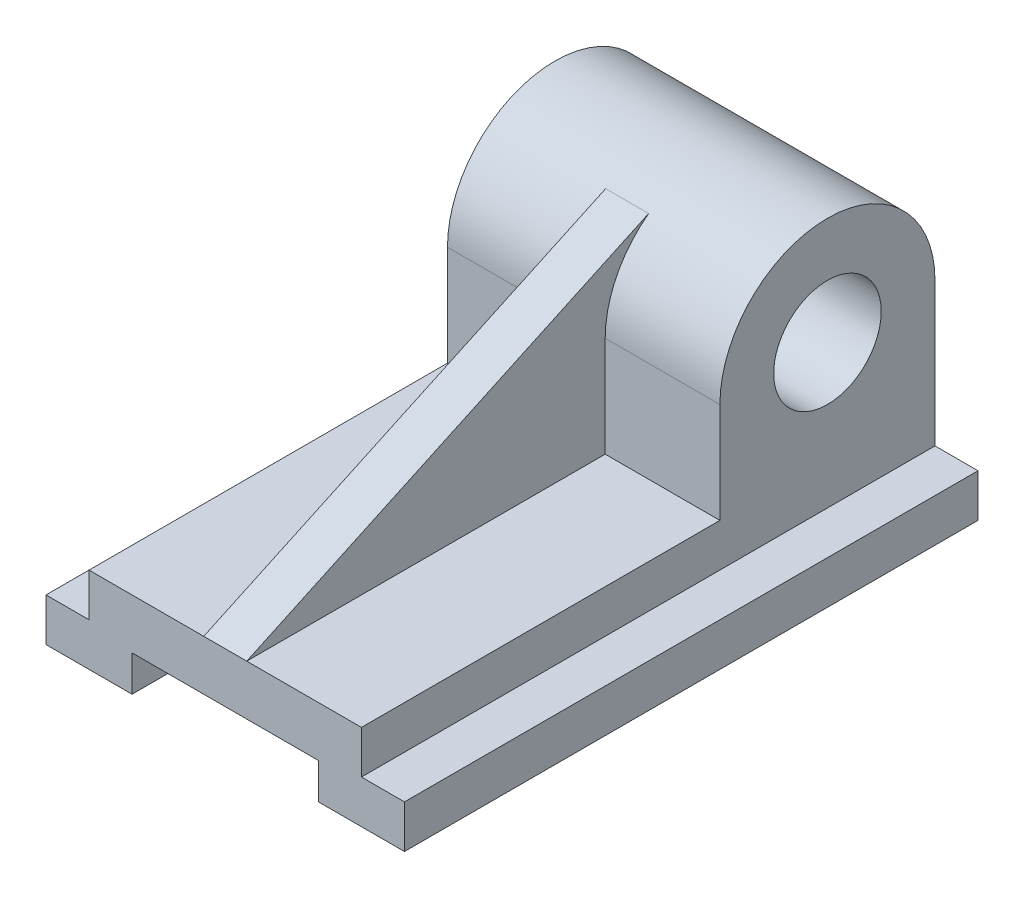
ISO-10303-21;
HEADER;
FILE_DESCRIPTION(('STEP AP214'),'2;1');
FILE_NAME('part.step','',(''),(''),'','','');
FILE_SCHEMA(('AUTOMOTIVE_DESIGN { 1 0 10303 214 1 1 1 1 }'));
ENDSEC;
DATA;
#1=APPLICATION_CONTEXT('core data for automotive mechanical design processes');
#2=APPLICATION_PROTOCOL_DEFINITION('international standard','automotive_design',2000,#1);
#3=PRODUCT_CONTEXT('',#1,'mechanical');
#4=PRODUCT('Part','Part','',(#3));
#5=PRODUCT_RELATED_PRODUCT_CATEGORY('part','',(#4));
#6=PRODUCT_DEFINITION_FORMATION('','',#4);
#7=PRODUCT_DEFINITION_CONTEXT('part definition',#1,'design');
#8=PRODUCT_DEFINITION('design','',#6,#7);
#9=PRODUCT_DEFINITION_SHAPE('','',#8);
#10=(LENGTH_UNIT() NAMED_UNIT(*) SI_UNIT(.MILLI.,.METRE.));
#11=(NAMED_UNIT(*) PLANE_ANGLE_UNIT() SI_UNIT($,.RADIAN.));
#12=(NAMED_UNIT(*) SI_UNIT($,.STERADIAN.) SOLID_ANGLE_UNIT());
#13=UNCERTAINTY_MEASURE_WITH_UNIT(LENGTH_MEASURE(1.E-05),#10,'distance_accuracy_value','');
#14=(GEOMETRIC_REPRESENTATION_CONTEXT(3) GLOBAL_UNCERTAINTY_ASSIGNED_CONTEXT((#13)) GLOBAL_UNIT_ASSIGNED_CONTEXT((#10,
#11,#12)) REPRESENTATION_CONTEXT('',''));
#15=CARTESIAN_POINT('',(0.,0.,0.));
#16=DIRECTION('',(0.,0.,1.));
#17=DIRECTION('',(1.,0.,0.));
#18=AXIS2_PLACEMENT_3D('',#15,#16,#17);
#19=CARTESIAN_POINT('',(0.,0.,160.));
#20=DIRECTION('',(0.,-1.,0.));
#21=DIRECTION('',(1.,0.,0.));
#22=AXIS2_PLACEMENT_3D('',#19,#20,#21);
#23=PLANE('',#22);
#24=DIRECTION('',(0.,0.,1.));
#25=VECTOR('',#24,1.);
#26=CARTESIAN_POINT('',(-5.99999999999999,0.,47.881736725958));
#27=LINE('',#26,#25);
#28=CARTESIAN_POINT('',(-5.99999999999999,0.,60.));
#29=VERTEX_POINT('',#28);
#30=CARTESIAN_POINT('',(-5.99999999999998,0.,160.));
#31=VERTEX_POINT('',#30);
#32=EDGE_CURVE('E169',#29,#31,#27,.T.);
#33=ORIENTED_EDGE('',*,*,#32,.F.);
#34=DIRECTION('',(1.,0.,0.));
#35=VECTOR('',#34,1.);
#36=CARTESIAN_POINT('',(-38.,0.,60.));
#37=LINE('',#36,#35);
#38=CARTESIAN_POINT('',(-38.,0.,60.));
#39=VERTEX_POINT('',#38);
#40=EDGE_CURVE('E57',#39,#29,#37,.T.);
#41=ORIENTED_EDGE('',*,*,#40,.F.);
#42=DIRECTION('',(0.,0.,-1.));
#43=VECTOR('',#42,1.);
#44=CARTESIAN_POINT('',(-38.,0.,160.));
#45=LINE('',#44,#43);
#46=CARTESIAN_POINT('',(-38.,0.,160.));
#47=VERTEX_POINT('',#46);
#48=EDGE_CURVE('E185',#47,#39,#45,.T.);
#49=ORIENTED_EDGE('',*,*,#48,.F.);
#50=DIRECTION('',(-1.,0.,0.));
#51=VECTOR('',#50,1.);
#52=CARTESIAN_POINT('',(38.,0.,160.));
#53=LINE('',#52,#51);
#54=EDGE_CURVE('E176',#31,#47,#53,.T.);
#55=ORIENTED_EDGE('',*,*,#54,.F.);
#56=EDGE_LOOP('',(#33,#41,#49,#55));
#57=FACE_BOUND('',#56,.T.);
#58=ADVANCED_FACE('F35',(#57),#23,.F.);
#59=DIRECTION('',(0.,0.,-1.));
#60=VECTOR('',#59,1.);
#61=CARTESIAN_POINT('',(6.00000000000002,0.,160.));
#62=LINE('',#61,#60);
#63=CARTESIAN_POINT('',(6.00000000000002,0.,160.));
#64=VERTEX_POINT('',#63);
#65=CARTESIAN_POINT('',(6.00000000000001,0.,60.));
#66=VERTEX_POINT('',#65);
#67=EDGE_CURVE('E183',#64,#66,#62,.T.);
#68=ORIENTED_EDGE('',*,*,#67,.F.);
#69=CARTESIAN_POINT('',(38.,0.,160.));
#70=VERTEX_POINT('',#69);
#71=EDGE_CURVE('E178',#70,#64,#53,.T.);
#72=ORIENTED_EDGE('',*,*,#71,.F.);
#73=DIRECTION('',(0.,0.,-1.));
#74=VECTOR('',#73,1.);
#75=CARTESIAN_POINT('',(38.,0.,160.));
#76=LINE('',#75,#74);
#77=CARTESIAN_POINT('',(38.,0.,60.));
#78=VERTEX_POINT('',#77);
#79=EDGE_CURVE('E217',#70,#78,#76,.T.);
#80=ORIENTED_EDGE('',*,*,#79,.T.);
#81=EDGE_CURVE('E301',#66,#78,#37,.T.);
#82=ORIENTED_EDGE('',*,*,#81,.F.);
#83=EDGE_LOOP('',(#68,#72,#80,#82));
#84=FACE_BOUND('',#83,.T.);
#85=ADVANCED_FACE('F368',(#84),#23,.F.);
#86=CARTESIAN_POINT('',(-38.,0.,60.));
#87=DIRECTION('',(0.,0.,-1.));
#88=DIRECTION('',(0.,1.,0.));
#89=AXIS2_PLACEMENT_3D('',#86,#87,#88);
#90=PLANE('',#89);
#91=DIRECTION('',(0.,-1.,0.));
#92=VECTOR('',#91,1.);
#93=CARTESIAN_POINT('',(-5.99999999999999,0.,60.));
#94=LINE('',#93,#92);
#95=CARTESIAN_POINT('',(-5.99999999999999,28.,60.));
#96=VERTEX_POINT('',#95);
#97=EDGE_CURVE('E182',#96,#29,#94,.T.);
#98=ORIENTED_EDGE('',*,*,#97,.F.);
#99=DIRECTION('',(1.,0.,0.));
#100=VECTOR('',#99,1.);
#101=CARTESIAN_POINT('',(-38.,28.,60.));
#102=LINE('',#101,#100);
#103=CARTESIAN_POINT('',(-38.,28.,60.));
#104=VERTEX_POINT('',#103);
#105=EDGE_CURVE('E277',#104,#96,#102,.T.);
#106=ORIENTED_EDGE('',*,*,#105,.F.);
#107=DIRECTION('',(0.,1.,0.));
#108=VECTOR('',#107,1.);
#109=CARTESIAN_POINT('',(-38.,0.,60.));
#110=LINE('',#109,#108);
#111=EDGE_CURVE('E295',#39,#104,#110,.T.);
#112=ORIENTED_EDGE('',*,*,#111,.F.);
#113=ORIENTED_EDGE('',*,*,#40,.T.);
#114=EDGE_LOOP('',(#98,#106,#112,#113));
#115=FACE_BOUND('',#114,.T.);
#116=ADVANCED_FACE('F279',(#115),#90,.F.);
#117=DIRECTION('',(0.,1.,0.));
#118=VECTOR('',#117,1.);
#119=CARTESIAN_POINT('',(6.00000000000001,0.,60.));
#120=LINE('',#119,#118);
#121=CARTESIAN_POINT('',(6.00000000000001,28.,60.));
#122=VERTEX_POINT('',#121);
#123=EDGE_CURVE('E49',#66,#122,#120,.T.);
#124=ORIENTED_EDGE('',*,*,#123,.F.);
#125=ORIENTED_EDGE('',*,*,#81,.T.);
#126=DIRECTION('',(0.,1.,0.));
#127=VECTOR('',#126,1.);
#128=CARTESIAN_POINT('',(38.,0.,60.));
#129=LINE('',#128,#127);
#130=CARTESIAN_POINT('',(38.,28.,60.));
#131=VERTEX_POINT('',#130);
#132=EDGE_CURVE('E293',#78,#131,#129,.T.);
#133=ORIENTED_EDGE('',*,*,#132,.T.);
#134=EDGE_CURVE('E302',#122,#131,#102,.T.);
#135=ORIENTED_EDGE('',*,*,#134,.F.);
#136=EDGE_LOOP('',(#124,#125,#133,#135));
#137=FACE_BOUND('',#136,.T.);
#138=ADVANCED_FACE('F387',(#137),#90,.F.);
#139=CARTESIAN_POINT('',(-38.,28.,30.));
#140=DIRECTION('',(1.,0.,0.));
#141=DIRECTION('',(0.,0.,-1.));
#142=AXIS2_PLACEMENT_3D('',#139,#140,#141);
#143=CYLINDRICAL_SURFACE('',#142,30.);
#144=ORIENTED_EDGE('',*,*,#134,.T.);
#145=CARTESIAN_POINT('',(38.,28.,30.));
#146=DIRECTION('',(1.,0.,0.));
#147=DIRECTION('',(0.,0.,-1.));
#148=AXIS2_PLACEMENT_3D('',#145,#146,#147);
#149=CIRCLE('',#148,30.);
#150=CARTESIAN_POINT('',(38.,28.,0.));
#151=VERTEX_POINT('',#150);
#152=EDGE_CURVE('E284',#151,#131,#149,.T.);
#153=ORIENTED_EDGE('',*,*,#152,.F.);
#154=DIRECTION('',(1.,0.,0.));
#155=VECTOR('',#154,1.);
#156=CARTESIAN_POINT('',(-38.,28.,0.));
#157=LINE('',#156,#155);
#158=CARTESIAN_POINT('',(-38.,28.,0.));
#159=VERTEX_POINT('',#158);
#160=EDGE_CURVE('E194',#159,#151,#157,.T.);
#161=ORIENTED_EDGE('',*,*,#160,.F.);
#162=CARTESIAN_POINT('',(-38.,28.,30.));
#163=DIRECTION('',(1.,0.,0.));
#164=DIRECTION('',(0.,0.,-1.));
#165=AXIS2_PLACEMENT_3D('',#162,#163,#164);
#166=CIRCLE('',#165,30.);
#167=EDGE_CURVE('E292',#159,#104,#166,.T.);
#168=ORIENTED_EDGE('',*,*,#167,.T.);
#169=ORIENTED_EDGE('',*,*,#105,.T.);
#170=CARTESIAN_POINT('',(-5.99999999999999,28.,30.));
#171=DIRECTION('',(1.,0.,0.));
#172=DIRECTION('',(0.,0.,-1.));
#173=AXIS2_PLACEMENT_3D('',#170,#171,#172);
#174=CIRCLE('',#173,30.);
#175=CARTESIAN_POINT('',(-5.99999999999999,52.0882438476433,47.881736725958));
#176=VERTEX_POINT('',#175);
#177=EDGE_CURVE('E11',#96,#176,#174,.F.);
#178=ORIENTED_EDGE('',*,*,#177,.T.);
#179=DIRECTION('',(1.,0.,0.));
#180=VECTOR('',#179,1.);
#181=CARTESIAN_POINT('',(-38.,52.0882438476433,47.881736725958));
#182=LINE('',#181,#180);
#183=CARTESIAN_POINT('',(6.00000000000001,52.0882438476433,47.881736725958));
#184=VERTEX_POINT('',#183);
#185=EDGE_CURVE('E42',#176,#184,#182,.T.);
#186=ORIENTED_EDGE('',*,*,#185,.T.);
#187=CARTESIAN_POINT('',(6.00000000000001,28.,30.));
#188=DIRECTION('',(-1.,0.,0.));
#189=DIRECTION('',(0.,0.,1.));
#190=AXIS2_PLACEMENT_3D('',#187,#188,#189);
#191=CIRCLE('',#190,30.);
#192=EDGE_CURVE('E270',#184,#122,#191,.F.);
#193=ORIENTED_EDGE('',*,*,#192,.T.);
#194=EDGE_LOOP('',(#144,#153,#161,#168,#169,#178,#186,#193));
#195=FACE_BOUND('',#194,.T.);
#196=ADVANCED_FACE('F273',(#195),#143,.T.);
#197=CARTESIAN_POINT('',(-38.,0.,160.));
#198=DIRECTION('',(1.,0.,0.));
#199=DIRECTION('',(0.,0.,-1.));
#200=AXIS2_PLACEMENT_3D('',#197,#198,#199);
#201=PLANE('',#200);
#202=DIRECTION('',(0.,-1.,0.));
#203=VECTOR('',#202,1.);
#204=CARTESIAN_POINT('',(-38.,0.,0.));
#205=LINE('',#204,#203);
#206=CARTESIAN_POINT('',(-38.,-12.,0.));
#207=VERTEX_POINT('',#206);
#208=EDGE_CURVE('E218',#159,#207,#205,.T.);
#209=ORIENTED_EDGE('',*,*,#208,.T.);
#210=DIRECTION('',(0.,0.,-1.));
#211=VECTOR('',#210,1.);
#212=CARTESIAN_POINT('',(-38.,-12.,160.));
#213=LINE('',#212,#211);
#214=CARTESIAN_POINT('',(-38.,-12.,160.));
#215=VERTEX_POINT('',#214);
#216=EDGE_CURVE('E266',#215,#207,#213,.T.);
#217=ORIENTED_EDGE('',*,*,#216,.F.);
#218=DIRECTION('',(0.,-1.,0.));
#219=VECTOR('',#218,1.);
#220=CARTESIAN_POINT('',(-38.,0.,160.));
#221=LINE('',#220,#219);
#222=EDGE_CURVE('E189',#47,#215,#221,.T.);
#223=ORIENTED_EDGE('',*,*,#222,.F.);
#224=ORIENTED_EDGE('',*,*,#48,.T.);
#225=ORIENTED_EDGE('',*,*,#111,.T.);
#226=ORIENTED_EDGE('',*,*,#167,.F.);
#227=EDGE_LOOP('',(#209,#217,#223,#224,#225,#226));
#228=FACE_BOUND('',#227,.T.);
#229=CARTESIAN_POINT('',(-38.,28.,30.));
#230=DIRECTION('',(1.,0.,0.));
#231=DIRECTION('',(0.,0.,-1.));
#232=AXIS2_PLACEMENT_3D('',#229,#230,#231);
#233=CIRCLE('',#232,15.);
#234=CARTESIAN_POINT('',(-38.,28.,15.));
#235=VERTEX_POINT('',#234);
#236=EDGE_CURVE('E289',#235,#235,#233,.T.);
#237=ORIENTED_EDGE('',*,*,#236,.T.);
#238=EDGE_LOOP('',(#237));
#239=FACE_BOUND('',#238,.T.);
#240=ADVANCED_FACE('F363',(#228,#239),#201,.F.);
#241=CARTESIAN_POINT('',(-38.,-12.,160.));
#242=DIRECTION('',(0.,-1.,0.));
#243=DIRECTION('',(1.,0.,0.));
#244=AXIS2_PLACEMENT_3D('',#241,#242,#243);
#245=PLANE('',#244);
#246=DIRECTION('',(-1.,0.,0.));
#247=VECTOR('',#246,1.);
#248=CARTESIAN_POINT('',(-38.,-12.,0.));
#249=LINE('',#248,#247);
#250=CARTESIAN_POINT('',(-50.,-12.,0.));
#251=VERTEX_POINT('',#250);
#252=EDGE_CURVE('E220',#207,#251,#249,.T.);
#253=ORIENTED_EDGE('',*,*,#252,.T.);
#254=DIRECTION('',(0.,0.,-1.));
#255=VECTOR('',#254,1.);
#256=CARTESIAN_POINT('',(-50.,-12.,160.));
#257=LINE('',#256,#255);
#258=CARTESIAN_POINT('',(-50.,-12.,160.));
#259=VERTEX_POINT('',#258);
#260=EDGE_CURVE('E263',#259,#251,#257,.T.);
#261=ORIENTED_EDGE('',*,*,#260,.F.);
#262=DIRECTION('',(-1.,0.,0.));
#263=VECTOR('',#262,1.);
#264=CARTESIAN_POINT('',(-38.,-12.,160.));
#265=LINE('',#264,#263);
#266=EDGE_CURVE('E197',#215,#259,#265,.T.);
#267=ORIENTED_EDGE('',*,*,#266,.F.);
#268=ORIENTED_EDGE('',*,*,#216,.T.);
#269=EDGE_LOOP('',(#253,#261,#267,#268));
#270=FACE_BOUND('',#269,.T.);
#271=ADVANCED_FACE('F360',(#270),#245,.F.);
#272=CARTESIAN_POINT('',(-50.,-12.,160.));
#273=DIRECTION('',(1.,0.,0.));
#274=DIRECTION('',(0.,1.,0.));
#275=AXIS2_PLACEMENT_3D('',#272,#273,#274);
#276=PLANE('',#275);
#277=DIRECTION('',(0.,-1.,0.));
#278=VECTOR('',#277,1.);
#279=CARTESIAN_POINT('',(-50.,-12.,0.));
#280=LINE('',#279,#278);
#281=CARTESIAN_POINT('',(-50.,-24.,0.));
#282=VERTEX_POINT('',#281);
#283=EDGE_CURVE('E222',#251,#282,#280,.T.);
#284=ORIENTED_EDGE('',*,*,#283,.T.);
#285=DIRECTION('',(0.,0.,-1.));
#286=VECTOR('',#285,1.);
#287=CARTESIAN_POINT('',(-50.,-24.,160.));
#288=LINE('',#287,#286);
#289=CARTESIAN_POINT('',(-50.,-24.,160.));
#290=VERTEX_POINT('',#289);
#291=EDGE_CURVE('E260',#290,#282,#288,.T.);
#292=ORIENTED_EDGE('',*,*,#291,.F.);
#293=DIRECTION('',(0.,-1.,0.));
#294=VECTOR('',#293,1.);
#295=CARTESIAN_POINT('',(-50.,-12.,160.));
#296=LINE('',#295,#294);
#297=EDGE_CURVE('E199',#259,#290,#296,.T.);
#298=ORIENTED_EDGE('',*,*,#297,.F.);
#299=ORIENTED_EDGE('',*,*,#260,.T.);
#300=EDGE_LOOP('',(#284,#292,#298,#299));
#301=FACE_BOUND('',#300,.T.);
#302=ADVANCED_FACE('F355',(#301),#276,.F.);
#303=CARTESIAN_POINT('',(-50.,-24.,160.));
#304=DIRECTION('',(0.,1.,0.));
#305=DIRECTION('',(0.,0.,1.));
#306=AXIS2_PLACEMENT_3D('',#303,#304,#305);
#307=PLANE('',#306);
#308=DIRECTION('',(1.,0.,0.));
#309=VECTOR('',#308,1.);
#310=CARTESIAN_POINT('',(-50.,-24.,0.));
#311=LINE('',#310,#309);
#312=CARTESIAN_POINT('',(-26.,-24.,0.));
#313=VERTEX_POINT('',#312);
#314=EDGE_CURVE('E224',#282,#313,#311,.T.);
#315=ORIENTED_EDGE('',*,*,#314,.T.);
#316=DIRECTION('',(0.,0.,-1.));
#317=VECTOR('',#316,1.);
#318=CARTESIAN_POINT('',(-26.,-24.,160.));
#319=LINE('',#318,#317);
#320=CARTESIAN_POINT('',(-26.,-24.,160.));
#321=VERTEX_POINT('',#320);
#322=EDGE_CURVE('E257',#321,#313,#319,.T.);
#323=ORIENTED_EDGE('',*,*,#322,.F.);
#324=DIRECTION('',(1.,0.,0.));
#325=VECTOR('',#324,1.);
#326=CARTESIAN_POINT('',(-50.,-24.,160.));
#327=LINE('',#326,#325);
#328=EDGE_CURVE('E201',#290,#321,#327,.T.);
#329=ORIENTED_EDGE('',*,*,#328,.F.);
#330=ORIENTED_EDGE('',*,*,#291,.T.);
#331=EDGE_LOOP('',(#315,#323,#329,#330));
#332=FACE_BOUND('',#331,.T.);
#333=ADVANCED_FACE('F351',(#332),#307,.F.);
#334=CARTESIAN_POINT('',(-26.,-24.,160.));
#335=DIRECTION('',(-1.,0.,0.));
#336=DIRECTION('',(0.,-1.,0.));
#337=AXIS2_PLACEMENT_3D('',#334,#335,#336);
#338=PLANE('',#337);
#339=DIRECTION('',(0.,1.,0.));
#340=VECTOR('',#339,1.);
#341=CARTESIAN_POINT('',(-26.,-24.,0.));
#342=LINE('',#341,#340);
#343=CARTESIAN_POINT('',(-26.,-14.,0.));
#344=VERTEX_POINT('',#343);
#345=EDGE_CURVE('E226',#313,#344,#342,.T.);
#346=ORIENTED_EDGE('',*,*,#345,.T.);
#347=DIRECTION('',(0.,0.,-1.));
#348=VECTOR('',#347,1.);
#349=CARTESIAN_POINT('',(-26.,-14.,160.));
#350=LINE('',#349,#348);
#351=CARTESIAN_POINT('',(-26.,-14.,160.));
#352=VERTEX_POINT('',#351);
#353=EDGE_CURVE('E254',#352,#344,#350,.T.);
#354=ORIENTED_EDGE('',*,*,#353,.F.);
#355=DIRECTION('',(0.,1.,0.));
#356=VECTOR('',#355,1.);
#357=CARTESIAN_POINT('',(-26.,-24.,160.));
#358=LINE('',#357,#356);
#359=EDGE_CURVE('E203',#321,#352,#358,.T.);
#360=ORIENTED_EDGE('',*,*,#359,.F.);
#361=ORIENTED_EDGE('',*,*,#322,.T.);
#362=EDGE_LOOP('',(#346,#354,#360,#361));
#363=FACE_BOUND('',#362,.T.);
#364=ADVANCED_FACE('F347',(#363),#338,.F.);
#365=CARTESIAN_POINT('',(-26.,-14.,160.));
#366=DIRECTION('',(0.,1.,0.));
#367=DIRECTION('',(0.,0.,1.));
#368=AXIS2_PLACEMENT_3D('',#365,#366,#367);
#369=PLANE('',#368);
#370=DIRECTION('',(1.,0.,0.));
#371=VECTOR('',#370,1.);
#372=CARTESIAN_POINT('',(-26.,-14.,0.));
#373=LINE('',#372,#371);
#374=CARTESIAN_POINT('',(26.,-14.,0.));
#375=VERTEX_POINT('',#374);
#376=EDGE_CURVE('E228',#344,#375,#373,.T.);
#377=ORIENTED_EDGE('',*,*,#376,.T.);
#378=DIRECTION('',(0.,0.,-1.));
#379=VECTOR('',#378,1.);
#380=CARTESIAN_POINT('',(26.,-14.,160.));
#381=LINE('',#380,#379);
#382=CARTESIAN_POINT('',(26.,-14.,160.));
#383=VERTEX_POINT('',#382);
#384=EDGE_CURVE('E251',#383,#375,#381,.T.);
#385=ORIENTED_EDGE('',*,*,#384,.F.);
#386=DIRECTION('',(1.,0.,0.));
#387=VECTOR('',#386,1.);
#388=CARTESIAN_POINT('',(-26.,-14.,160.));
#389=LINE('',#388,#387);
#390=EDGE_CURVE('E205',#352,#383,#389,.T.);
#391=ORIENTED_EDGE('',*,*,#390,.F.);
#392=ORIENTED_EDGE('',*,*,#353,.T.);
#393=EDGE_LOOP('',(#377,#385,#391,#392));
#394=FACE_BOUND('',#393,.T.);
#395=ADVANCED_FACE('F342',(#394),#369,.F.);
#396=CARTESIAN_POINT('',(26.,-14.,160.));
#397=DIRECTION('',(1.,0.,0.));
#398=DIRECTION('',(0.,1.,0.));
#399=AXIS2_PLACEMENT_3D('',#396,#397,#398);
#400=PLANE('',#399);
#401=DIRECTION('',(0.,-1.,0.));
#402=VECTOR('',#401,1.);
#403=CARTESIAN_POINT('',(26.,-14.,0.));
#404=LINE('',#403,#402);
#405=CARTESIAN_POINT('',(26.,-24.,0.));
#406=VERTEX_POINT('',#405);
#407=EDGE_CURVE('E230',#375,#406,#404,.T.);
#408=ORIENTED_EDGE('',*,*,#407,.T.);
#409=DIRECTION('',(0.,0.,-1.));
#410=VECTOR('',#409,1.);
#411=CARTESIAN_POINT('',(26.,-24.,160.));
#412=LINE('',#411,#410);
#413=CARTESIAN_POINT('',(26.,-24.,160.));
#414=VERTEX_POINT('',#413);
#415=EDGE_CURVE('E248',#414,#406,#412,.T.);
#416=ORIENTED_EDGE('',*,*,#415,.F.);
#417=DIRECTION('',(0.,-1.,0.));
#418=VECTOR('',#417,1.);
#419=CARTESIAN_POINT('',(26.,-14.,160.));
#420=LINE('',#419,#418);
#421=EDGE_CURVE('E207',#383,#414,#420,.T.);
#422=ORIENTED_EDGE('',*,*,#421,.F.);
#423=ORIENTED_EDGE('',*,*,#384,.T.);
#424=EDGE_LOOP('',(#408,#416,#422,#423));
#425=FACE_BOUND('',#424,.T.);
#426=ADVANCED_FACE('F336',(#425),#400,.F.);
#427=CARTESIAN_POINT('',(26.,-24.,160.));
#428=DIRECTION('',(0.,1.,0.));
#429=DIRECTION('',(0.,0.,1.));
#430=AXIS2_PLACEMENT_3D('',#427,#428,#429);
#431=PLANE('',#430);
#432=DIRECTION('',(1.,0.,0.));
#433=VECTOR('',#432,1.);
#434=CARTESIAN_POINT('',(26.,-24.,0.));
#435=LINE('',#434,#433);
#436=CARTESIAN_POINT('',(50.,-24.,0.));
#437=VERTEX_POINT('',#436);
#438=EDGE_CURVE('E232',#406,#437,#435,.T.);
#439=ORIENTED_EDGE('',*,*,#438,.T.);
#440=DIRECTION('',(0.,0.,-1.));
#441=VECTOR('',#440,1.);
#442=CARTESIAN_POINT('',(50.,-24.,160.));
#443=LINE('',#442,#441);
#444=CARTESIAN_POINT('',(50.,-24.,160.));
#445=VERTEX_POINT('',#444);
#446=EDGE_CURVE('E245',#445,#437,#443,.T.);
#447=ORIENTED_EDGE('',*,*,#446,.F.);
#448=DIRECTION('',(1.,0.,0.));
#449=VECTOR('',#448,1.);
#450=CARTESIAN_POINT('',(26.,-24.,160.));
#451=LINE('',#450,#449);
#452=EDGE_CURVE('E209',#414,#445,#451,.T.);
#453=ORIENTED_EDGE('',*,*,#452,.F.);
#454=ORIENTED_EDGE('',*,*,#415,.T.);
#455=EDGE_LOOP('',(#439,#447,#453,#454));
#456=FACE_BOUND('',#455,.T.);
#457=ADVANCED_FACE('F332',(#456),#431,.F.);
#458=CARTESIAN_POINT('',(50.,-24.,160.));
#459=DIRECTION('',(-1.,0.,0.));
#460=DIRECTION('',(0.,-1.,0.));
#461=AXIS2_PLACEMENT_3D('',#458,#459,#460);
#462=PLANE('',#461);
#463=DIRECTION('',(0.,1.,0.));
#464=VECTOR('',#463,1.);
#465=CARTESIAN_POINT('',(50.,-24.,0.));
#466=LINE('',#465,#464);
#467=CARTESIAN_POINT('',(50.,-12.,0.));
#468=VERTEX_POINT('',#467);
#469=EDGE_CURVE('E234',#437,#468,#466,.T.);
#470=ORIENTED_EDGE('',*,*,#469,.T.);
#471=DIRECTION('',(0.,0.,-1.));
#472=VECTOR('',#471,1.);
#473=CARTESIAN_POINT('',(50.,-12.,160.));
#474=LINE('',#473,#472);
#475=CARTESIAN_POINT('',(50.,-12.,160.));
#476=VERTEX_POINT('',#475);
#477=EDGE_CURVE('E242',#476,#468,#474,.T.);
#478=ORIENTED_EDGE('',*,*,#477,.F.);
#479=DIRECTION('',(0.,1.,0.));
#480=VECTOR('',#479,1.);
#481=CARTESIAN_POINT('',(50.,-24.,160.));
#482=LINE('',#481,#480);
#483=EDGE_CURVE('E211',#445,#476,#482,.T.);
#484=ORIENTED_EDGE('',*,*,#483,.F.);
#485=ORIENTED_EDGE('',*,*,#446,.T.);
#486=EDGE_LOOP('',(#470,#478,#484,#485));
#487=FACE_BOUND('',#486,.T.);
#488=ADVANCED_FACE('F327',(#487),#462,.F.);
#489=CARTESIAN_POINT('',(50.,-12.,160.));
#490=DIRECTION('',(0.,-1.,0.));
#491=DIRECTION('',(0.,0.,-1.));
#492=AXIS2_PLACEMENT_3D('',#489,#490,#491);
#493=PLANE('',#492);
#494=DIRECTION('',(-1.,0.,0.));
#495=VECTOR('',#494,1.);
#496=CARTESIAN_POINT('',(50.,-12.,0.));
#497=LINE('',#496,#495);
#498=CARTESIAN_POINT('',(38.,-12.,0.));
#499=VERTEX_POINT('',#498);
#500=EDGE_CURVE('E190',#468,#499,#497,.T.);
#501=ORIENTED_EDGE('',*,*,#500,.T.);
#502=DIRECTION('',(0.,0.,-1.));
#503=VECTOR('',#502,1.);
#504=CARTESIAN_POINT('',(38.,-12.,160.));
#505=LINE('',#504,#503);
#506=CARTESIAN_POINT('',(38.,-12.,160.));
#507=VERTEX_POINT('',#506);
#508=EDGE_CURVE('E239',#507,#499,#505,.T.);
#509=ORIENTED_EDGE('',*,*,#508,.F.);
#510=DIRECTION('',(-1.,0.,0.));
#511=VECTOR('',#510,1.);
#512=CARTESIAN_POINT('',(50.,-12.,160.));
#513=LINE('',#512,#511);
#514=EDGE_CURVE('E213',#476,#507,#513,.T.);
#515=ORIENTED_EDGE('',*,*,#514,.F.);
#516=ORIENTED_EDGE('',*,*,#477,.T.);
#517=EDGE_LOOP('',(#501,#509,#515,#516));
#518=FACE_BOUND('',#517,.T.);
#519=ADVANCED_FACE('F321',(#518),#493,.F.);
#520=CARTESIAN_POINT('',(38.,-12.,160.));
#521=DIRECTION('',(-1.,0.,0.));
#522=DIRECTION('',(0.,0.,1.));
#523=AXIS2_PLACEMENT_3D('',#520,#521,#522);
#524=PLANE('',#523);
#525=DIRECTION('',(0.,1.,0.));
#526=VECTOR('',#525,1.);
#527=CARTESIAN_POINT('',(38.,-12.,0.));
#528=LINE('',#527,#526);
#529=EDGE_CURVE('E187',#499,#151,#528,.T.);
#530=ORIENTED_EDGE('',*,*,#529,.T.);
#531=ORIENTED_EDGE('',*,*,#152,.T.);
#532=ORIENTED_EDGE('',*,*,#132,.F.);
#533=ORIENTED_EDGE('',*,*,#79,.F.);
#534=DIRECTION('',(0.,1.,0.));
#535=VECTOR('',#534,1.);
#536=CARTESIAN_POINT('',(38.,-12.,160.));
#537=LINE('',#536,#535);
#538=EDGE_CURVE('E215',#507,#70,#537,.T.);
#539=ORIENTED_EDGE('',*,*,#538,.F.);
#540=ORIENTED_EDGE('',*,*,#508,.T.);
#541=EDGE_LOOP('',(#530,#531,#532,#533,#539,#540));
#542=FACE_BOUND('',#541,.T.);
#543=CARTESIAN_POINT('',(38.,28.,30.));
#544=DIRECTION('',(1.,0.,0.));
#545=DIRECTION('',(0.,0.,-1.));
#546=AXIS2_PLACEMENT_3D('',#543,#544,#545);
#547=CIRCLE('',#546,15.);
#548=CARTESIAN_POINT('',(38.,28.,15.));
#549=VERTEX_POINT('',#548);
#550=EDGE_CURVE('E281',#549,#549,#547,.T.);
#551=ORIENTED_EDGE('',*,*,#550,.F.);
#552=EDGE_LOOP('',(#551));
#553=FACE_BOUND('',#552,.T.);
#554=ADVANCED_FACE('F314',(#542,#553),#524,.F.);
#555=CARTESIAN_POINT('',(0.,0.,160.));
#556=DIRECTION('',(0.,0.,1.));
#557=DIRECTION('',(1.,0.,0.));
#558=AXIS2_PLACEMENT_3D('',#555,#556,#557);
#559=PLANE('',#558);
#560=DIRECTION('',(1.,0.,0.));
#561=VECTOR('',#560,1.);
#562=CARTESIAN_POINT('',(-50.,0.,160.));
#563=LINE('',#562,#561);
#564=EDGE_CURVE('E164',#31,#64,#563,.T.);
#565=ORIENTED_EDGE('',*,*,#564,.F.);
#566=ORIENTED_EDGE('',*,*,#54,.T.);
#567=ORIENTED_EDGE('',*,*,#222,.T.);
#568=ORIENTED_EDGE('',*,*,#266,.T.);
#569=ORIENTED_EDGE('',*,*,#297,.T.);
#570=ORIENTED_EDGE('',*,*,#328,.T.);
#571=ORIENTED_EDGE('',*,*,#359,.T.);
#572=ORIENTED_EDGE('',*,*,#390,.T.);
#573=ORIENTED_EDGE('',*,*,#421,.T.);
#574=ORIENTED_EDGE('',*,*,#452,.T.);
#575=ORIENTED_EDGE('',*,*,#483,.T.);
#576=ORIENTED_EDGE('',*,*,#514,.T.);
#577=ORIENTED_EDGE('',*,*,#538,.T.);
#578=ORIENTED_EDGE('',*,*,#71,.T.);
#579=EDGE_LOOP('',(#565,#566,#567,#568,#569,#570,#571,#572,#573,#574,#575,#576,#577,#578));
#580=FACE_BOUND('',#579,.T.);
#581=ADVANCED_FACE('F174',(#580),#559,.T.);
#582=CARTESIAN_POINT('',(0.,0.,0.));
#583=DIRECTION('',(0.,0.,1.));
#584=DIRECTION('',(1.,0.,0.));
#585=AXIS2_PLACEMENT_3D('',#582,#583,#584);
#586=PLANE('',#585);
#587=ORIENTED_EDGE('',*,*,#208,.F.);
#588=ORIENTED_EDGE('',*,*,#160,.T.);
#589=ORIENTED_EDGE('',*,*,#529,.F.);
#590=ORIENTED_EDGE('',*,*,#500,.F.);
#591=ORIENTED_EDGE('',*,*,#469,.F.);
#592=ORIENTED_EDGE('',*,*,#438,.F.);
#593=ORIENTED_EDGE('',*,*,#407,.F.);
#594=ORIENTED_EDGE('',*,*,#376,.F.);
#595=ORIENTED_EDGE('',*,*,#345,.F.);
#596=ORIENTED_EDGE('',*,*,#314,.F.);
#597=ORIENTED_EDGE('',*,*,#283,.F.);
#598=ORIENTED_EDGE('',*,*,#252,.F.);
#599=EDGE_LOOP('',(#587,#588,#589,#590,#591,#592,#593,#594,#595,#596,#597,#598));
#600=FACE_BOUND('',#599,.T.);
#601=ADVANCED_FACE('F308',(#600),#586,.F.);
#602=CARTESIAN_POINT('',(-38.,28.,30.));
#603=DIRECTION('',(1.,0.,0.));
#604=DIRECTION('',(0.,0.,-1.));
#605=AXIS2_PLACEMENT_3D('',#602,#603,#604);
#606=CYLINDRICAL_SURFACE('',#605,15.);
#607=ORIENTED_EDGE('',*,*,#236,.F.);
#608=EDGE_LOOP('',(#607));
#609=FACE_BOUND('',#608,.T.);
#610=ORIENTED_EDGE('',*,*,#550,.T.);
#611=EDGE_LOOP('',(#610));
#612=FACE_BOUND('',#611,.T.);
#613=ADVANCED_FACE('F378',(#609,#612),#606,.F.);
#614=CARTESIAN_POINT('',(-5.99999999999999,72.,47.881736725958));
#615=DIRECTION('',(1.,0.,0.));
#616=DIRECTION('',(0.,0.,-1.));
#617=AXIS2_PLACEMENT_3D('',#614,#615,#616);
#618=PLANE('',#617);
#619=ORIENTED_EDGE('',*,*,#32,.T.);
#620=DIRECTION('',(0.,0.421333124341428,-0.906905947897957));
#621=VECTOR('',#620,1.);
#622=CARTESIAN_POINT('',(-5.99999999999999,55.6230106918185,40.2732652096827));
#623=LINE('',#622,#621);
#624=EDGE_CURVE('E161',#31,#176,#623,.T.);
#625=ORIENTED_EDGE('',*,*,#624,.T.);
#626=ORIENTED_EDGE('',*,*,#177,.F.);
#627=ORIENTED_EDGE('',*,*,#97,.T.);
#628=EDGE_LOOP('',(#619,#625,#626,#627));
#629=FACE_BOUND('',#628,.T.);
#630=ADVANCED_FACE('F180',(#629),#618,.F.);
#631=CARTESIAN_POINT('',(6.00000000000002,72.,160.));
#632=DIRECTION('',(-1.,0.,0.));
#633=DIRECTION('',(0.,0.,1.));
#634=AXIS2_PLACEMENT_3D('',#631,#632,#633);
#635=PLANE('',#634);
#636=ORIENTED_EDGE('',*,*,#192,.F.);
#637=DIRECTION('',(0.,-0.421333124341428,0.906905947897957));
#638=VECTOR('',#637,1.);
#639=CARTESIAN_POINT('',(6.00000000000002,12.7815553200462,132.48811481116));
#640=LINE('',#639,#638);
#641=EDGE_CURVE('E170',#184,#64,#640,.T.);
#642=ORIENTED_EDGE('',*,*,#641,.T.);
#643=ORIENTED_EDGE('',*,*,#67,.T.);
#644=ORIENTED_EDGE('',*,*,#123,.T.);
#645=EDGE_LOOP('',(#636,#642,#643,#644));
#646=FACE_BOUND('',#645,.T.);
#647=ADVANCED_FACE('F370',(#646),#635,.F.);
#648=CARTESIAN_POINT('',(-50.,52.0882438476433,47.881736725958));
#649=DIRECTION('',(0.,-0.906905947897957,-0.421333124341428));
#650=DIRECTION('',(0.,0.421333124341428,-0.906905947897957));
#651=AXIS2_PLACEMENT_3D('',#648,#649,#650);
#652=PLANE('',#651);
#653=ORIENTED_EDGE('',*,*,#564,.T.);
#654=ORIENTED_EDGE('',*,*,#641,.F.);
#655=ORIENTED_EDGE('',*,*,#185,.F.);
#656=ORIENTED_EDGE('',*,*,#624,.F.);
#657=EDGE_LOOP('',(#653,#654,#655,#656));
#658=FACE_BOUND('',#657,.T.);
#659=ADVANCED_FACE('F163',(#658),#652,.F.);
#660=CLOSED_SHELL('',(#58,#85,#116,#138,#196,#240,#271,#302,#333,#364,#395,#426,#457,#488,#519,
#554,#581,#601,#613,#630,#647,#659));
#661=MANIFOLD_SOLID_BREP('B2',#660);
#662=ADVANCED_BREP_SHAPE_REPRESENTATION('',(#18,#661),#14);
#663=SHAPE_DEFINITION_REPRESENTATION(#9,#662);
ENDSEC;
END-ISO-10303-21;
